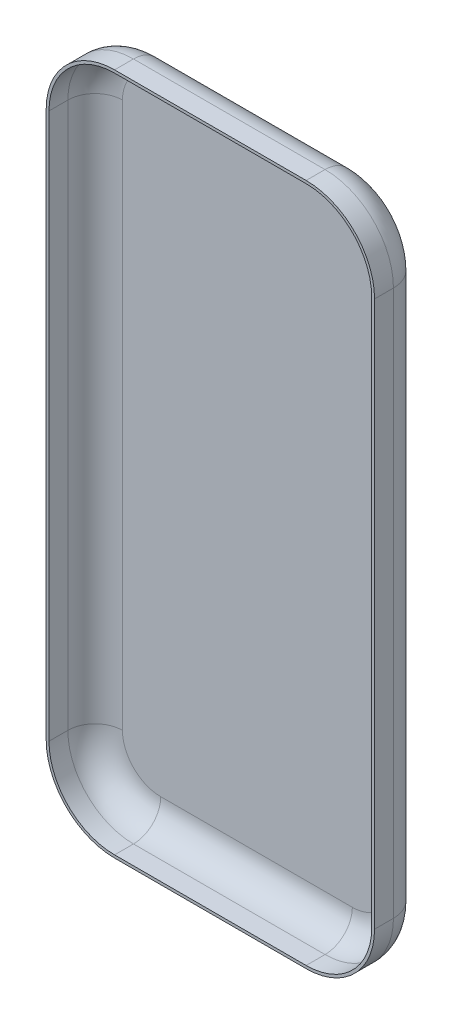
ISO-10303-21;
HEADER;
FILE_DESCRIPTION(('STEP AP214'),'2;1');
FILE_NAME('part.step','',(''),(''),'','','');
FILE_SCHEMA(('AUTOMOTIVE_DESIGN { 1 0 10303 214 1 1 1 1 }'));
ENDSEC;
DATA;
#1=APPLICATION_CONTEXT('core data for automotive mechanical design processes');
#2=APPLICATION_PROTOCOL_DEFINITION('international standard','automotive_design',2000,#1);
#3=PRODUCT_CONTEXT('',#1,'mechanical');
#4=PRODUCT('Part','Part','',(#3));
#5=PRODUCT_RELATED_PRODUCT_CATEGORY('part','',(#4));
#6=PRODUCT_DEFINITION_FORMATION('','',#4);
#7=PRODUCT_DEFINITION_CONTEXT('part definition',#1,'design');
#8=PRODUCT_DEFINITION('design','',#6,#7);
#9=PRODUCT_DEFINITION_SHAPE('','',#8);
#10=(LENGTH_UNIT() NAMED_UNIT(*) SI_UNIT(.MILLI.,.METRE.));
#11=(NAMED_UNIT(*) PLANE_ANGLE_UNIT() SI_UNIT($,.RADIAN.));
#12=(NAMED_UNIT(*) SI_UNIT($,.STERADIAN.) SOLID_ANGLE_UNIT());
#13=UNCERTAINTY_MEASURE_WITH_UNIT(LENGTH_MEASURE(1.E-05),#10,'distance_accuracy_value','');
#14=(GEOMETRIC_REPRESENTATION_CONTEXT(3) GLOBAL_UNCERTAINTY_ASSIGNED_CONTEXT((#13)) GLOBAL_UNIT_ASSIGNED_CONTEXT((#10,
#11,#12)) REPRESENTATION_CONTEXT('',''));
#15=CARTESIAN_POINT('',(0.,0.,0.));
#16=DIRECTION('',(0.,0.,1.));
#17=DIRECTION('',(1.,0.,0.));
#18=AXIS2_PLACEMENT_3D('',#15,#16,#17);
#19=CARTESIAN_POINT('',(-23.8379,0.,-7.112));
#20=DIRECTION('',(-1.,0.,0.));
#21=DIRECTION('',(0.,-1.,0.));
#22=AXIS2_PLACEMENT_3D('',#19,#20,#21);
#23=PLANE('',#22);
#24=DIRECTION('',(0.,0.,1.));
#25=VECTOR('',#24,1.);
#26=CARTESIAN_POINT('',(-23.8379,20.3454,-7.112));
#27=LINE('',#26,#25);
#28=CARTESIAN_POINT('',(-23.8379,20.3454,0.));
#29=VERTEX_POINT('',#28);
#30=CARTESIAN_POINT('',(-23.8379,20.3454,-2.7432));
#31=VERTEX_POINT('',#30);
#32=EDGE_CURVE('E315',#29,#31,#27,.F.);
#33=ORIENTED_EDGE('',*,*,#32,.T.);
#34=DIRECTION('',(0.,-1.,0.));
#35=VECTOR('',#34,1.);
#36=CARTESIAN_POINT('',(-23.8379,-58.902600000003,-2.7432));
#37=LINE('',#36,#35);
#38=CARTESIAN_POINT('',(-23.8379,-58.902600000003,-2.7432));
#39=VERTEX_POINT('',#38);
#40=EDGE_CURVE('E344',#31,#39,#37,.T.);
#41=ORIENTED_EDGE('',*,*,#40,.T.);
#42=DIRECTION('',(0.,0.,1.));
#43=VECTOR('',#42,1.);
#44=CARTESIAN_POINT('',(-23.8379,-58.902600000003,-7.112));
#45=LINE('',#44,#43);
#46=CARTESIAN_POINT('',(-23.8379,-58.902600000003,0.));
#47=VERTEX_POINT('',#46);
#48=EDGE_CURVE('E313',#39,#47,#45,.T.);
#49=ORIENTED_EDGE('',*,*,#48,.T.);
#50=DIRECTION('',(0.,-1.,0.));
#51=VECTOR('',#50,1.);
#52=CARTESIAN_POINT('',(-23.8379,0.,0.));
#53=LINE('',#52,#51);
#54=EDGE_CURVE('E280',#29,#47,#53,.T.);
#55=ORIENTED_EDGE('',*,*,#54,.F.);
#56=EDGE_LOOP('',(#33,#41,#49,#55));
#57=FACE_BOUND('',#56,.T.);
#58=ADVANCED_FACE('F45',(#57),#23,.T.);
#59=CARTESIAN_POINT('',(23.8379,-68.834000000003,-7.112));
#60=DIRECTION('',(1.,0.,0.));
#61=DIRECTION('',(0.,1.,0.));
#62=AXIS2_PLACEMENT_3D('',#59,#60,#61);
#63=PLANE('',#62);
#64=DIRECTION('',(0.,0.,1.));
#65=VECTOR('',#64,1.);
#66=CARTESIAN_POINT('',(23.8379,-58.902600000003,-7.112));
#67=LINE('',#66,#65);
#68=CARTESIAN_POINT('',(23.8379,-58.902600000003,0.));
#69=VERTEX_POINT('',#68);
#70=CARTESIAN_POINT('',(23.8379,-58.902600000003,-2.7432));
#71=VERTEX_POINT('',#70);
#72=EDGE_CURVE('E306',#69,#71,#67,.F.);
#73=ORIENTED_EDGE('',*,*,#72,.T.);
#74=DIRECTION('',(0.,1.,0.));
#75=VECTOR('',#74,1.);
#76=CARTESIAN_POINT('',(23.8379,20.3454,-2.7432));
#77=LINE('',#76,#75);
#78=CARTESIAN_POINT('',(23.8379,20.3454,-2.7432));
#79=VERTEX_POINT('',#78);
#80=EDGE_CURVE('E11',#71,#79,#77,.T.);
#81=ORIENTED_EDGE('',*,*,#80,.T.);
#82=DIRECTION('',(0.,0.,-1.));
#83=VECTOR('',#82,1.);
#84=CARTESIAN_POINT('',(23.8379,20.3454,-7.112));
#85=LINE('',#84,#83);
#86=CARTESIAN_POINT('',(23.8379,20.3454,0.));
#87=VERTEX_POINT('',#86);
#88=EDGE_CURVE('E304',#79,#87,#85,.F.);
#89=ORIENTED_EDGE('',*,*,#88,.T.);
#90=DIRECTION('',(0.,1.,0.));
#91=VECTOR('',#90,1.);
#92=CARTESIAN_POINT('',(23.8379,-68.834000000003,0.));
#93=LINE('',#92,#91);
#94=EDGE_CURVE('E287',#69,#87,#93,.T.);
#95=ORIENTED_EDGE('',*,*,#94,.F.);
#96=EDGE_LOOP('',(#73,#81,#89,#95));
#97=FACE_BOUND('',#96,.T.);
#98=ADVANCED_FACE('F388',(#97),#63,.T.);
#99=CARTESIAN_POINT('',(-23.8379,-68.834000000003,-7.112));
#100=DIRECTION('',(0.,-1.,0.));
#101=DIRECTION('',(0.,0.,-1.));
#102=AXIS2_PLACEMENT_3D('',#99,#100,#101);
#103=PLANE('',#102);
#104=DIRECTION('',(0.,0.,1.));
#105=VECTOR('',#104,1.);
#106=CARTESIAN_POINT('',(-13.9065,-68.834000000003,-7.112));
#107=LINE('',#106,#105);
#108=CARTESIAN_POINT('',(-13.9065,-68.834000000003,0.));
#109=VERTEX_POINT('',#108);
#110=CARTESIAN_POINT('',(-13.9065,-68.834000000003,-2.7432));
#111=VERTEX_POINT('',#110);
#112=EDGE_CURVE('E291',#109,#111,#107,.F.);
#113=ORIENTED_EDGE('',*,*,#112,.T.);
#114=DIRECTION('',(1.,0.,0.));
#115=VECTOR('',#114,1.);
#116=CARTESIAN_POINT('',(13.9065,-68.834000000003,-2.7432));
#117=LINE('',#116,#115);
#118=CARTESIAN_POINT('',(13.9065,-68.834000000003,-2.7432));
#119=VERTEX_POINT('',#118);
#120=EDGE_CURVE('E349',#111,#119,#117,.T.);
#121=ORIENTED_EDGE('',*,*,#120,.T.);
#122=DIRECTION('',(0.,0.,1.));
#123=VECTOR('',#122,1.);
#124=CARTESIAN_POINT('',(13.9065,-68.834000000003,-7.112));
#125=LINE('',#124,#123);
#126=CARTESIAN_POINT('',(13.9065,-68.834000000003,0.));
#127=VERTEX_POINT('',#126);
#128=EDGE_CURVE('E294',#119,#127,#125,.T.);
#129=ORIENTED_EDGE('',*,*,#128,.T.);
#130=DIRECTION('',(1.,0.,0.));
#131=VECTOR('',#130,1.);
#132=CARTESIAN_POINT('',(-23.8379,-68.834000000003,0.));
#133=LINE('',#132,#131);
#134=EDGE_CURVE('E284',#109,#127,#133,.T.);
#135=ORIENTED_EDGE('',*,*,#134,.F.);
#136=EDGE_LOOP('',(#113,#121,#129,#135));
#137=FACE_BOUND('',#136,.T.);
#138=ADVANCED_FACE('F418',(#137),#103,.T.);
#139=CARTESIAN_POINT('',(-23.8379,-68.834000000003,-7.112));
#140=DIRECTION('',(0.,0.,1.));
#141=DIRECTION('',(1.,0.,0.));
#142=AXIS2_PLACEMENT_3D('',#139,#140,#141);
#143=PLANE('',#142);
#144=DIRECTION('',(0.,-1.,0.));
#145=VECTOR('',#144,1.);
#146=CARTESIAN_POINT('',(-19.4691,20.3454,-7.112));
#147=LINE('',#146,#145);
#148=CARTESIAN_POINT('',(-19.4691,-58.902600000003,-7.112));
#149=VERTEX_POINT('',#148);
#150=CARTESIAN_POINT('',(-19.4691,20.3454,-7.112));
#151=VERTEX_POINT('',#150);
#152=EDGE_CURVE('E327',#149,#151,#147,.F.);
#153=ORIENTED_EDGE('',*,*,#152,.T.);
#154=CARTESIAN_POINT('',(-13.9065,20.3454,-7.112));
#155=DIRECTION('',(0.,0.,1.));
#156=DIRECTION('',(1.,0.,0.));
#157=AXIS2_PLACEMENT_3D('',#154,#155,#156);
#158=CIRCLE('',#157,5.5626);
#159=CARTESIAN_POINT('',(-13.9065,25.908,-7.112));
#160=VERTEX_POINT('',#159);
#161=EDGE_CURVE('E334',#151,#160,#158,.F.);
#162=ORIENTED_EDGE('',*,*,#161,.T.);
#163=DIRECTION('',(-1.,0.,0.));
#164=VECTOR('',#163,1.);
#165=CARTESIAN_POINT('',(13.9065,25.908,-7.112));
#166=LINE('',#165,#164);
#167=CARTESIAN_POINT('',(13.9065,25.908,-7.112));
#168=VERTEX_POINT('',#167);
#169=EDGE_CURVE('E332',#160,#168,#166,.F.);
#170=ORIENTED_EDGE('',*,*,#169,.T.);
#171=CARTESIAN_POINT('',(13.9065,20.3454,-7.112));
#172=DIRECTION('',(0.,0.,1.));
#173=DIRECTION('',(1.,0.,0.));
#174=AXIS2_PLACEMENT_3D('',#171,#172,#173);
#175=CIRCLE('',#174,5.5626);
#176=CARTESIAN_POINT('',(19.4691,20.3454,-7.112));
#177=VERTEX_POINT('',#176);
#178=EDGE_CURVE('E330',#168,#177,#175,.F.);
#179=ORIENTED_EDGE('',*,*,#178,.T.);
#180=DIRECTION('',(0.,1.,0.));
#181=VECTOR('',#180,1.);
#182=CARTESIAN_POINT('',(19.4691,-58.902600000003,-7.112));
#183=LINE('',#182,#181);
#184=CARTESIAN_POINT('',(19.4691,-58.902600000003,-7.112));
#185=VERTEX_POINT('',#184);
#186=EDGE_CURVE('E320',#177,#185,#183,.F.);
#187=ORIENTED_EDGE('',*,*,#186,.T.);
#188=CARTESIAN_POINT('',(13.9065,-58.902600000003,-7.112));
#189=DIRECTION('',(0.,0.,1.));
#190=DIRECTION('',(1.,0.,0.));
#191=AXIS2_PLACEMENT_3D('',#188,#189,#190);
#192=CIRCLE('',#191,5.5626);
#193=CARTESIAN_POINT('',(13.9065,-64.465200000003,-7.112));
#194=VERTEX_POINT('',#193);
#195=EDGE_CURVE('E318',#185,#194,#192,.F.);
#196=ORIENTED_EDGE('',*,*,#195,.T.);
#197=DIRECTION('',(1.,0.,0.));
#198=VECTOR('',#197,1.);
#199=CARTESIAN_POINT('',(-13.9065,-64.465200000003,-7.112));
#200=LINE('',#199,#198);
#201=CARTESIAN_POINT('',(-13.9065,-64.465200000003,-7.112));
#202=VERTEX_POINT('',#201);
#203=EDGE_CURVE('E323',#194,#202,#200,.F.);
#204=ORIENTED_EDGE('',*,*,#203,.T.);
#205=CARTESIAN_POINT('',(-13.9065,-58.902600000003,-7.112));
#206=DIRECTION('',(0.,0.,1.));
#207=DIRECTION('',(1.,0.,0.));
#208=AXIS2_PLACEMENT_3D('',#205,#206,#207);
#209=CIRCLE('',#208,5.5626);
#210=EDGE_CURVE('E325',#202,#149,#209,.F.);
#211=ORIENTED_EDGE('',*,*,#210,.T.);
#212=EDGE_LOOP('',(#153,#162,#170,#179,#187,#196,#204,#211));
#213=FACE_BOUND('',#212,.T.);
#214=ADVANCED_FACE('F437',(#213),#143,.F.);
#215=CARTESIAN_POINT('',(-23.8379,-68.834000000003,0.));
#216=DIRECTION('',(0.,0.,1.));
#217=DIRECTION('',(1.,0.,0.));
#218=AXIS2_PLACEMENT_3D('',#215,#216,#217);
#219=PLANE('',#218);
#220=DIRECTION('',(1.,0.,0.));
#221=VECTOR('',#220,1.);
#222=CARTESIAN_POINT('',(-23.8379,-68.427600000003,0.));
#223=LINE('',#222,#221);
#224=CARTESIAN_POINT('',(-13.9065,-68.427600000003,0.));
#225=VERTEX_POINT('',#224);
#226=CARTESIAN_POINT('',(13.9065,-68.427600000003,0.));
#227=VERTEX_POINT('',#226);
#228=EDGE_CURVE('E256',#225,#227,#223,.T.);
#229=ORIENTED_EDGE('',*,*,#228,.F.);
#230=CARTESIAN_POINT('',(-13.9065,-58.902600000003,0.));
#231=DIRECTION('',(0.,0.,1.));
#232=DIRECTION('',(1.,0.,0.));
#233=AXIS2_PLACEMENT_3D('',#230,#231,#232);
#234=CIRCLE('',#233,9.525);
#235=CARTESIAN_POINT('',(-23.4315,-58.902600000003,0.));
#236=VERTEX_POINT('',#235);
#237=EDGE_CURVE('E258',#236,#225,#234,.T.);
#238=ORIENTED_EDGE('',*,*,#237,.F.);
#239=DIRECTION('',(0.,-1.,0.));
#240=VECTOR('',#239,1.);
#241=CARTESIAN_POINT('',(-23.4315,-68.834000000003,0.));
#242=LINE('',#241,#240);
#243=CARTESIAN_POINT('',(-23.4315,20.3454,0.));
#244=VERTEX_POINT('',#243);
#245=EDGE_CURVE('E63',#244,#236,#242,.T.);
#246=ORIENTED_EDGE('',*,*,#245,.F.);
#247=CARTESIAN_POINT('',(-13.9065,20.3454,0.));
#248=DIRECTION('',(0.,0.,1.));
#249=DIRECTION('',(1.,0.,0.));
#250=AXIS2_PLACEMENT_3D('',#247,#248,#249);
#251=CIRCLE('',#250,9.525);
#252=CARTESIAN_POINT('',(-13.9065,29.8704,0.));
#253=VERTEX_POINT('',#252);
#254=EDGE_CURVE('E260',#253,#244,#251,.T.);
#255=ORIENTED_EDGE('',*,*,#254,.F.);
#256=DIRECTION('',(1.,0.,0.));
#257=VECTOR('',#256,1.);
#258=CARTESIAN_POINT('',(-23.8379,29.8704,0.));
#259=LINE('',#258,#257);
#260=CARTESIAN_POINT('',(13.9065,29.8704,0.));
#261=VERTEX_POINT('',#260);
#262=EDGE_CURVE('E257',#253,#261,#259,.T.);
#263=ORIENTED_EDGE('',*,*,#262,.T.);
#264=CARTESIAN_POINT('',(13.9065,20.3454,0.));
#265=DIRECTION('',(0.,0.,1.));
#266=DIRECTION('',(1.,0.,0.));
#267=AXIS2_PLACEMENT_3D('',#264,#265,#266);
#268=CIRCLE('',#267,9.525);
#269=CARTESIAN_POINT('',(23.4315,20.3454,0.));
#270=VERTEX_POINT('',#269);
#271=EDGE_CURVE('E268',#270,#261,#268,.T.);
#272=ORIENTED_EDGE('',*,*,#271,.F.);
#273=DIRECTION('',(0.,1.,0.));
#274=VECTOR('',#273,1.);
#275=CARTESIAN_POINT('',(23.4315,-68.834000000003,0.));
#276=LINE('',#275,#274);
#277=CARTESIAN_POINT('',(23.4315,-58.902600000003,0.));
#278=VERTEX_POINT('',#277);
#279=EDGE_CURVE('E264',#278,#270,#276,.T.);
#280=ORIENTED_EDGE('',*,*,#279,.F.);
#281=CARTESIAN_POINT('',(13.9065,-58.902600000003,0.));
#282=DIRECTION('',(0.,0.,1.));
#283=DIRECTION('',(1.,0.,0.));
#284=AXIS2_PLACEMENT_3D('',#281,#282,#283);
#285=CIRCLE('',#284,9.525);
#286=EDGE_CURVE('E265',#227,#278,#285,.T.);
#287=ORIENTED_EDGE('',*,*,#286,.F.);
#288=EDGE_LOOP('',(#229,#238,#246,#255,#263,#272,#280,#287));
#289=FACE_BOUND('',#288,.T.);
#290=ORIENTED_EDGE('',*,*,#134,.T.);
#291=CARTESIAN_POINT('',(13.9065,-58.902600000003,0.));
#292=DIRECTION('',(0.,0.,1.));
#293=DIRECTION('',(1.,0.,0.));
#294=AXIS2_PLACEMENT_3D('',#291,#292,#293);
#295=CIRCLE('',#294,9.9314);
#296=EDGE_CURVE('E302',#127,#69,#295,.T.);
#297=ORIENTED_EDGE('',*,*,#296,.T.);
#298=ORIENTED_EDGE('',*,*,#94,.T.);
#299=CARTESIAN_POINT('',(13.9065,20.3454,0.));
#300=DIRECTION('',(0.,0.,1.));
#301=DIRECTION('',(1.,0.,0.));
#302=AXIS2_PLACEMENT_3D('',#299,#300,#301);
#303=CIRCLE('',#302,9.9314);
#304=CARTESIAN_POINT('',(13.9065,30.2768,0.));
#305=VERTEX_POINT('',#304);
#306=EDGE_CURVE('E300',#87,#305,#303,.T.);
#307=ORIENTED_EDGE('',*,*,#306,.T.);
#308=DIRECTION('',(1.,0.,0.));
#309=VECTOR('',#308,1.);
#310=CARTESIAN_POINT('',(-23.8379,30.2768,0.));
#311=LINE('',#310,#309);
#312=CARTESIAN_POINT('',(-13.9065,30.2768,0.));
#313=VERTEX_POINT('',#312);
#314=EDGE_CURVE('E277',#313,#305,#311,.T.);
#315=ORIENTED_EDGE('',*,*,#314,.F.);
#316=CARTESIAN_POINT('',(-13.9065,20.3454,0.));
#317=DIRECTION('',(0.,0.,1.));
#318=DIRECTION('',(1.,0.,0.));
#319=AXIS2_PLACEMENT_3D('',#316,#317,#318);
#320=CIRCLE('',#319,9.9314);
#321=EDGE_CURVE('E298',#313,#29,#320,.T.);
#322=ORIENTED_EDGE('',*,*,#321,.T.);
#323=ORIENTED_EDGE('',*,*,#54,.T.);
#324=CARTESIAN_POINT('',(-13.9065,-58.902600000003,0.));
#325=DIRECTION('',(0.,0.,1.));
#326=DIRECTION('',(1.,0.,0.));
#327=AXIS2_PLACEMENT_3D('',#324,#325,#326);
#328=CIRCLE('',#327,9.9314);
#329=EDGE_CURVE('E296',#47,#109,#328,.T.);
#330=ORIENTED_EDGE('',*,*,#329,.T.);
#331=EDGE_LOOP('',(#290,#297,#298,#307,#315,#322,#323,#330));
#332=FACE_BOUND('',#331,.T.);
#333=ADVANCED_FACE('F396',(#289,#332),#219,.T.);
#334=CARTESIAN_POINT('',(-23.8379,30.2768,0.));
#335=DIRECTION('',(0.,1.,0.));
#336=DIRECTION('',(0.,0.,1.));
#337=AXIS2_PLACEMENT_3D('',#334,#335,#336);
#338=PLANE('',#337);
#339=DIRECTION('',(0.,0.,-1.));
#340=VECTOR('',#339,1.);
#341=CARTESIAN_POINT('',(13.9065,30.2768,0.));
#342=LINE('',#341,#340);
#343=CARTESIAN_POINT('',(13.9065,30.2768,-2.7432));
#344=VERTEX_POINT('',#343);
#345=EDGE_CURVE('E310',#305,#344,#342,.T.);
#346=ORIENTED_EDGE('',*,*,#345,.T.);
#347=DIRECTION('',(-1.,0.,0.));
#348=VECTOR('',#347,1.);
#349=CARTESIAN_POINT('',(-13.9065,30.2768,-2.7432));
#350=LINE('',#349,#348);
#351=CARTESIAN_POINT('',(-13.9065,30.2768,-2.7432));
#352=VERTEX_POINT('',#351);
#353=EDGE_CURVE('E340',#344,#352,#350,.T.);
#354=ORIENTED_EDGE('',*,*,#353,.T.);
#355=DIRECTION('',(0.,0.,1.));
#356=VECTOR('',#355,1.);
#357=CARTESIAN_POINT('',(-13.9065,30.2768,0.));
#358=LINE('',#357,#356);
#359=EDGE_CURVE('E308',#352,#313,#358,.T.);
#360=ORIENTED_EDGE('',*,*,#359,.T.);
#361=ORIENTED_EDGE('',*,*,#314,.T.);
#362=EDGE_LOOP('',(#346,#354,#360,#361));
#363=FACE_BOUND('',#362,.T.);
#364=ADVANCED_FACE('F398',(#363),#338,.T.);
#365=CARTESIAN_POINT('',(13.9065,-58.902600000003,-7.112));
#366=DIRECTION('',(0.,0.,1.));
#367=DIRECTION('',(1.,0.,0.));
#368=AXIS2_PLACEMENT_3D('',#365,#366,#367);
#369=CYLINDRICAL_SURFACE('',#368,9.9314);
#370=ORIENTED_EDGE('',*,*,#128,.F.);
#371=CARTESIAN_POINT('',(13.9065,-58.902600000003,-2.7432));
#372=DIRECTION('',(0.,0.,1.));
#373=DIRECTION('',(1.,0.,0.));
#374=AXIS2_PLACEMENT_3D('',#371,#372,#373);
#375=CIRCLE('',#374,9.9314);
#376=EDGE_CURVE('E55',#119,#71,#375,.T.);
#377=ORIENTED_EDGE('',*,*,#376,.T.);
#378=ORIENTED_EDGE('',*,*,#72,.F.);
#379=ORIENTED_EDGE('',*,*,#296,.F.);
#380=EDGE_LOOP('',(#370,#377,#378,#379));
#381=FACE_BOUND('',#380,.T.);
#382=ADVANCED_FACE('F420',(#381),#369,.T.);
#383=CARTESIAN_POINT('',(13.9065,20.3454,0.));
#384=DIRECTION('',(0.,0.,-1.));
#385=DIRECTION('',(-1.,0.,0.));
#386=AXIS2_PLACEMENT_3D('',#383,#384,#385);
#387=CYLINDRICAL_SURFACE('',#386,9.9314);
#388=ORIENTED_EDGE('',*,*,#88,.F.);
#389=CARTESIAN_POINT('',(13.9065,20.3454,-2.7432));
#390=DIRECTION('',(0.,0.,1.));
#391=DIRECTION('',(1.,0.,0.));
#392=AXIS2_PLACEMENT_3D('',#389,#390,#391);
#393=CIRCLE('',#392,9.9314);
#394=EDGE_CURVE('E342',#79,#344,#393,.T.);
#395=ORIENTED_EDGE('',*,*,#394,.T.);
#396=ORIENTED_EDGE('',*,*,#345,.F.);
#397=ORIENTED_EDGE('',*,*,#306,.F.);
#398=EDGE_LOOP('',(#388,#395,#396,#397));
#399=FACE_BOUND('',#398,.T.);
#400=ADVANCED_FACE('F392',(#399),#387,.T.);
#401=CARTESIAN_POINT('',(-13.9065,20.3454,0.));
#402=DIRECTION('',(0.,0.,1.));
#403=DIRECTION('',(1.,0.,0.));
#404=AXIS2_PLACEMENT_3D('',#401,#402,#403);
#405=CYLINDRICAL_SURFACE('',#404,9.9314);
#406=ORIENTED_EDGE('',*,*,#359,.F.);
#407=CARTESIAN_POINT('',(-13.9065,20.3454,-2.7432));
#408=DIRECTION('',(0.,0.,1.));
#409=DIRECTION('',(1.,0.,0.));
#410=AXIS2_PLACEMENT_3D('',#407,#408,#409);
#411=CIRCLE('',#410,9.9314);
#412=EDGE_CURVE('E337',#352,#31,#411,.T.);
#413=ORIENTED_EDGE('',*,*,#412,.T.);
#414=ORIENTED_EDGE('',*,*,#32,.F.);
#415=ORIENTED_EDGE('',*,*,#321,.F.);
#416=EDGE_LOOP('',(#406,#413,#414,#415));
#417=FACE_BOUND('',#416,.T.);
#418=ADVANCED_FACE('F406',(#417),#405,.T.);
#419=CARTESIAN_POINT('',(-13.9065,-58.902600000003,-7.112));
#420=DIRECTION('',(0.,0.,1.));
#421=DIRECTION('',(1.,0.,0.));
#422=AXIS2_PLACEMENT_3D('',#419,#420,#421);
#423=CYLINDRICAL_SURFACE('',#422,9.9314);
#424=ORIENTED_EDGE('',*,*,#48,.F.);
#425=CARTESIAN_POINT('',(-13.9065,-58.902600000003,-2.7432));
#426=DIRECTION('',(0.,0.,1.));
#427=DIRECTION('',(1.,0.,0.));
#428=AXIS2_PLACEMENT_3D('',#425,#426,#427);
#429=CIRCLE('',#428,9.9314);
#430=EDGE_CURVE('E347',#39,#111,#429,.T.);
#431=ORIENTED_EDGE('',*,*,#430,.T.);
#432=ORIENTED_EDGE('',*,*,#112,.F.);
#433=ORIENTED_EDGE('',*,*,#329,.F.);
#434=EDGE_LOOP('',(#424,#431,#432,#433));
#435=FACE_BOUND('',#434,.T.);
#436=ADVANCED_FACE('F415',(#435),#423,.T.);
#437=CARTESIAN_POINT('',(13.9065,-58.902600000003,-2.7432));
#438=DIRECTION('',(0.,0.,1.));
#439=DIRECTION('',(1.,0.,0.));
#440=AXIS2_PLACEMENT_3D('',#437,#438,#439);
#441=TOROIDAL_SURFACE('',#440,5.5626,4.3688);
#442=CARTESIAN_POINT('',(19.4691,-58.902600000003,-2.7432));
#443=DIRECTION('',(0.,1.,0.));
#444=DIRECTION('',(0.,0.,1.));
#445=AXIS2_PLACEMENT_3D('',#442,#443,#444);
#446=CIRCLE('',#445,4.3688);
#447=EDGE_CURVE('E368',#71,#185,#446,.T.);
#448=ORIENTED_EDGE('',*,*,#447,.F.);
#449=ORIENTED_EDGE('',*,*,#376,.F.);
#450=CARTESIAN_POINT('',(13.9065,-64.465200000003,-2.7432));
#451=DIRECTION('',(-1.,0.,0.));
#452=DIRECTION('',(0.,0.,1.));
#453=AXIS2_PLACEMENT_3D('',#450,#451,#452);
#454=CIRCLE('',#453,4.3688);
#455=EDGE_CURVE('E49',#194,#119,#454,.T.);
#456=ORIENTED_EDGE('',*,*,#455,.F.);
#457=ORIENTED_EDGE('',*,*,#195,.F.);
#458=EDGE_LOOP('',(#448,#449,#456,#457));
#459=FACE_BOUND('',#458,.T.);
#460=ADVANCED_FACE('F47',(#459),#441,.T.);
#461=CARTESIAN_POINT('',(-23.8379,-64.465200000003,-2.7432));
#462=DIRECTION('',(-1.,0.,0.));
#463=DIRECTION('',(0.,0.,1.));
#464=AXIS2_PLACEMENT_3D('',#461,#462,#463);
#465=CYLINDRICAL_SURFACE('',#464,4.3688);
#466=ORIENTED_EDGE('',*,*,#455,.T.);
#467=ORIENTED_EDGE('',*,*,#120,.F.);
#468=CARTESIAN_POINT('',(-13.9065,-64.465200000003,-2.7432));
#469=DIRECTION('',(-1.,0.,0.));
#470=DIRECTION('',(0.,0.,1.));
#471=AXIS2_PLACEMENT_3D('',#468,#469,#470);
#472=CIRCLE('',#471,4.3688);
#473=EDGE_CURVE('E366',#202,#111,#472,.T.);
#474=ORIENTED_EDGE('',*,*,#473,.F.);
#475=ORIENTED_EDGE('',*,*,#203,.F.);
#476=EDGE_LOOP('',(#466,#467,#474,#475));
#477=FACE_BOUND('',#476,.T.);
#478=ADVANCED_FACE('F379',(#477),#465,.T.);
#479=CARTESIAN_POINT('',(19.4691,-68.834000000003,-2.7432));
#480=DIRECTION('',(0.,-1.,0.));
#481=DIRECTION('',(1.,0.,0.));
#482=AXIS2_PLACEMENT_3D('',#479,#480,#481);
#483=CYLINDRICAL_SURFACE('',#482,4.3688);
#484=ORIENTED_EDGE('',*,*,#447,.T.);
#485=ORIENTED_EDGE('',*,*,#186,.F.);
#486=CARTESIAN_POINT('',(19.4691,20.3454,-2.7432));
#487=DIRECTION('',(0.,1.,0.));
#488=DIRECTION('',(0.,0.,1.));
#489=AXIS2_PLACEMENT_3D('',#486,#487,#488);
#490=CIRCLE('',#489,4.3688);
#491=EDGE_CURVE('E363',#79,#177,#490,.T.);
#492=ORIENTED_EDGE('',*,*,#491,.F.);
#493=ORIENTED_EDGE('',*,*,#80,.F.);
#494=EDGE_LOOP('',(#484,#485,#492,#493));
#495=FACE_BOUND('',#494,.T.);
#496=ADVANCED_FACE('F384',(#495),#483,.T.);
#497=CARTESIAN_POINT('',(-13.9065,-58.902600000003,-2.7432));
#498=DIRECTION('',(0.,0.,1.));
#499=DIRECTION('',(1.,0.,0.));
#500=AXIS2_PLACEMENT_3D('',#497,#498,#499);
#501=TOROIDAL_SURFACE('',#500,5.5626,4.3688);
#502=ORIENTED_EDGE('',*,*,#473,.T.);
#503=ORIENTED_EDGE('',*,*,#430,.F.);
#504=CARTESIAN_POINT('',(-19.4691,-58.902600000003,-2.7432));
#505=DIRECTION('',(0.,1.,0.));
#506=DIRECTION('',(0.,0.,1.));
#507=AXIS2_PLACEMENT_3D('',#504,#505,#506);
#508=CIRCLE('',#507,4.3688);
#509=EDGE_CURVE('E360',#149,#39,#508,.T.);
#510=ORIENTED_EDGE('',*,*,#509,.F.);
#511=ORIENTED_EDGE('',*,*,#210,.F.);
#512=EDGE_LOOP('',(#502,#503,#510,#511));
#513=FACE_BOUND('',#512,.T.);
#514=ADVANCED_FACE('F526',(#513),#501,.T.);
#515=CARTESIAN_POINT('',(13.9065,20.3454,-2.7432));
#516=DIRECTION('',(0.,0.,1.));
#517=DIRECTION('',(1.,0.,0.));
#518=AXIS2_PLACEMENT_3D('',#515,#516,#517);
#519=TOROIDAL_SURFACE('',#518,5.5626,4.3688);
#520=ORIENTED_EDGE('',*,*,#491,.T.);
#521=ORIENTED_EDGE('',*,*,#178,.F.);
#522=CARTESIAN_POINT('',(13.9065,25.908,-2.7432));
#523=DIRECTION('',(-1.,0.,0.));
#524=DIRECTION('',(0.,0.,1.));
#525=AXIS2_PLACEMENT_3D('',#522,#523,#524);
#526=CIRCLE('',#525,4.3688);
#527=EDGE_CURVE('E357',#344,#168,#526,.T.);
#528=ORIENTED_EDGE('',*,*,#527,.F.);
#529=ORIENTED_EDGE('',*,*,#394,.F.);
#530=EDGE_LOOP('',(#520,#521,#528,#529));
#531=FACE_BOUND('',#530,.T.);
#532=ADVANCED_FACE('F522',(#531),#519,.T.);
#533=CARTESIAN_POINT('',(-19.4691,0.,-2.7432));
#534=DIRECTION('',(0.,1.,0.));
#535=DIRECTION('',(-1.,0.,0.));
#536=AXIS2_PLACEMENT_3D('',#533,#534,#535);
#537=CYLINDRICAL_SURFACE('',#536,4.3688);
#538=ORIENTED_EDGE('',*,*,#509,.T.);
#539=ORIENTED_EDGE('',*,*,#40,.F.);
#540=CARTESIAN_POINT('',(-19.4691,20.3454,-2.7432));
#541=DIRECTION('',(0.,1.,0.));
#542=DIRECTION('',(0.,0.,1.));
#543=AXIS2_PLACEMENT_3D('',#540,#541,#542);
#544=CIRCLE('',#543,4.3688);
#545=EDGE_CURVE('E354',#151,#31,#544,.T.);
#546=ORIENTED_EDGE('',*,*,#545,.F.);
#547=ORIENTED_EDGE('',*,*,#152,.F.);
#548=EDGE_LOOP('',(#538,#539,#546,#547));
#549=FACE_BOUND('',#548,.T.);
#550=ADVANCED_FACE('F514',(#549),#537,.T.);
#551=CARTESIAN_POINT('',(-23.8379,25.908,-2.7432));
#552=DIRECTION('',(1.,0.,0.));
#553=DIRECTION('',(0.,0.,-1.));
#554=AXIS2_PLACEMENT_3D('',#551,#552,#553);
#555=CYLINDRICAL_SURFACE('',#554,4.3688);
#556=ORIENTED_EDGE('',*,*,#527,.T.);
#557=ORIENTED_EDGE('',*,*,#169,.F.);
#558=CARTESIAN_POINT('',(-13.9065,25.908,-2.7432));
#559=DIRECTION('',(-1.,0.,0.));
#560=DIRECTION('',(0.,0.,1.));
#561=AXIS2_PLACEMENT_3D('',#558,#559,#560);
#562=CIRCLE('',#561,4.3688);
#563=EDGE_CURVE('E352',#352,#160,#562,.T.);
#564=ORIENTED_EDGE('',*,*,#563,.F.);
#565=ORIENTED_EDGE('',*,*,#353,.F.);
#566=EDGE_LOOP('',(#556,#557,#564,#565));
#567=FACE_BOUND('',#566,.T.);
#568=ADVANCED_FACE('F508',(#567),#555,.T.);
#569=CARTESIAN_POINT('',(-13.9065,20.3454,-2.7432));
#570=DIRECTION('',(0.,0.,1.));
#571=DIRECTION('',(1.,0.,0.));
#572=AXIS2_PLACEMENT_3D('',#569,#570,#571);
#573=TOROIDAL_SURFACE('',#572,5.5626,4.3688);
#574=ORIENTED_EDGE('',*,*,#545,.T.);
#575=ORIENTED_EDGE('',*,*,#412,.F.);
#576=ORIENTED_EDGE('',*,*,#563,.T.);
#577=ORIENTED_EDGE('',*,*,#161,.F.);
#578=EDGE_LOOP('',(#574,#575,#576,#577));
#579=FACE_BOUND('',#578,.T.);
#580=ADVANCED_FACE('F504',(#579),#573,.T.);
#581=CARTESIAN_POINT('',(-23.4315,0.,-7.112));
#582=DIRECTION('',(-1.,0.,0.));
#583=DIRECTION('',(0.,-1.,0.));
#584=AXIS2_PLACEMENT_3D('',#581,#582,#583);
#585=PLANE('',#584);
#586=DIRECTION('',(0.,0.,1.));
#587=VECTOR('',#586,1.);
#588=CARTESIAN_POINT('',(-23.4315,20.3454,-7.112));
#589=LINE('',#588,#587);
#590=CARTESIAN_POINT('',(-23.4315,20.3454,-2.7432));
#591=VERTEX_POINT('',#590);
#592=EDGE_CURVE('E228',#244,#591,#589,.F.);
#593=ORIENTED_EDGE('',*,*,#592,.F.);
#594=ORIENTED_EDGE('',*,*,#245,.T.);
#595=DIRECTION('',(0.,0.,1.));
#596=VECTOR('',#595,1.);
#597=CARTESIAN_POINT('',(-23.4315,-58.902600000003,-7.112));
#598=LINE('',#597,#596);
#599=CARTESIAN_POINT('',(-23.4315,-58.902600000003,-2.7432));
#600=VERTEX_POINT('',#599);
#601=EDGE_CURVE('E223',#600,#236,#598,.T.);
#602=ORIENTED_EDGE('',*,*,#601,.F.);
#603=DIRECTION('',(0.,-1.,0.));
#604=VECTOR('',#603,1.);
#605=CARTESIAN_POINT('',(-23.4315,0.,-2.7432));
#606=LINE('',#605,#604);
#607=EDGE_CURVE('E211',#591,#600,#606,.T.);
#608=ORIENTED_EDGE('',*,*,#607,.F.);
#609=EDGE_LOOP('',(#593,#594,#602,#608));
#610=FACE_BOUND('',#609,.T.);
#611=ADVANCED_FACE('F225',(#610),#585,.F.);
#612=CARTESIAN_POINT('',(23.4315,-68.834000000003,-7.112));
#613=DIRECTION('',(1.,0.,0.));
#614=DIRECTION('',(0.,1.,0.));
#615=AXIS2_PLACEMENT_3D('',#612,#613,#614);
#616=PLANE('',#615);
#617=DIRECTION('',(0.,0.,1.));
#618=VECTOR('',#617,1.);
#619=CARTESIAN_POINT('',(23.4315,-58.902600000003,-7.112));
#620=LINE('',#619,#618);
#621=CARTESIAN_POINT('',(23.4315,-58.902600000003,-2.7432));
#622=VERTEX_POINT('',#621);
#623=EDGE_CURVE('E871',#278,#622,#620,.F.);
#624=ORIENTED_EDGE('',*,*,#623,.F.);
#625=ORIENTED_EDGE('',*,*,#279,.T.);
#626=DIRECTION('',(0.,0.,1.));
#627=VECTOR('',#626,1.);
#628=CARTESIAN_POINT('',(23.4315,20.3454,-7.112));
#629=LINE('',#628,#627);
#630=CARTESIAN_POINT('',(23.4315,20.3454,-2.7432));
#631=VERTEX_POINT('',#630);
#632=EDGE_CURVE('E267',#631,#270,#629,.T.);
#633=ORIENTED_EDGE('',*,*,#632,.F.);
#634=DIRECTION('',(0.,1.,0.));
#635=VECTOR('',#634,1.);
#636=CARTESIAN_POINT('',(23.4315,-68.834000000003,-2.7432));
#637=LINE('',#636,#635);
#638=EDGE_CURVE('E355',#622,#631,#637,.T.);
#639=ORIENTED_EDGE('',*,*,#638,.F.);
#640=EDGE_LOOP('',(#624,#625,#633,#639));
#641=FACE_BOUND('',#640,.T.);
#642=ADVANCED_FACE('F498',(#641),#616,.F.);
#643=CARTESIAN_POINT('',(-23.8379,-68.427600000003,-7.112));
#644=DIRECTION('',(0.,-1.,0.));
#645=DIRECTION('',(0.,0.,-1.));
#646=AXIS2_PLACEMENT_3D('',#643,#644,#645);
#647=PLANE('',#646);
#648=DIRECTION('',(0.,0.,-1.));
#649=VECTOR('',#648,1.);
#650=CARTESIAN_POINT('',(-13.9065,-68.427600000003,-7.112));
#651=LINE('',#650,#649);
#652=CARTESIAN_POINT('',(-13.9065,-68.427600000003,-2.7432));
#653=VERTEX_POINT('',#652);
#654=EDGE_CURVE('E234',#225,#653,#651,.T.);
#655=ORIENTED_EDGE('',*,*,#654,.F.);
#656=ORIENTED_EDGE('',*,*,#228,.T.);
#657=DIRECTION('',(0.,0.,-1.));
#658=VECTOR('',#657,1.);
#659=CARTESIAN_POINT('',(13.9065,-68.427600000003,-7.112));
#660=LINE('',#659,#658);
#661=CARTESIAN_POINT('',(13.9065,-68.427600000003,-2.7432));
#662=VERTEX_POINT('',#661);
#663=EDGE_CURVE('E261',#662,#227,#660,.F.);
#664=ORIENTED_EDGE('',*,*,#663,.F.);
#665=DIRECTION('',(1.,0.,0.));
#666=VECTOR('',#665,1.);
#667=CARTESIAN_POINT('',(-23.8379,-68.427600000003,-2.7432));
#668=LINE('',#667,#666);
#669=EDGE_CURVE('E238',#653,#662,#668,.T.);
#670=ORIENTED_EDGE('',*,*,#669,.F.);
#671=EDGE_LOOP('',(#655,#656,#664,#670));
#672=FACE_BOUND('',#671,.T.);
#673=ADVANCED_FACE('F494',(#672),#647,.F.);
#674=CARTESIAN_POINT('',(-23.8379,-68.834000000003,-6.7056));
#675=DIRECTION('',(0.,0.,1.));
#676=DIRECTION('',(1.,0.,0.));
#677=AXIS2_PLACEMENT_3D('',#674,#675,#676);
#678=PLANE('',#677);
#679=DIRECTION('',(0.,1.,0.));
#680=VECTOR('',#679,1.);
#681=CARTESIAN_POINT('',(-19.4691,-68.834000000003,-6.7056));
#682=LINE('',#681,#680);
#683=CARTESIAN_POINT('',(-19.4691,-58.902600000003,-6.7056));
#684=VERTEX_POINT('',#683);
#685=CARTESIAN_POINT('',(-19.4691,20.3454,-6.7056));
#686=VERTEX_POINT('',#685);
#687=EDGE_CURVE('E913',#684,#686,#682,.T.);
#688=ORIENTED_EDGE('',*,*,#687,.F.);
#689=CARTESIAN_POINT('',(-13.9065,-58.902600000003,-6.7056));
#690=DIRECTION('',(0.,0.,1.));
#691=DIRECTION('',(1.,0.,0.));
#692=AXIS2_PLACEMENT_3D('',#689,#690,#691);
#693=CIRCLE('',#692,5.56259999999999);
#694=CARTESIAN_POINT('',(-13.9065,-64.465200000003,-6.7056));
#695=VERTEX_POINT('',#694);
#696=EDGE_CURVE('E242',#695,#684,#693,.F.);
#697=ORIENTED_EDGE('',*,*,#696,.F.);
#698=DIRECTION('',(1.,0.,0.));
#699=VECTOR('',#698,1.);
#700=CARTESIAN_POINT('',(-23.8379,-64.465200000003,-6.7056));
#701=LINE('',#700,#699);
#702=CARTESIAN_POINT('',(13.9065,-64.465200000003,-6.7056));
#703=VERTEX_POINT('',#702);
#704=EDGE_CURVE('E910',#703,#695,#701,.F.);
#705=ORIENTED_EDGE('',*,*,#704,.F.);
#706=CARTESIAN_POINT('',(13.9065,-58.902600000003,-6.7056));
#707=DIRECTION('',(0.,0.,1.));
#708=DIRECTION('',(1.,0.,0.));
#709=AXIS2_PLACEMENT_3D('',#706,#707,#708);
#710=CIRCLE('',#709,5.56259999999999);
#711=CARTESIAN_POINT('',(19.4691,-58.902600000003,-6.7056));
#712=VERTEX_POINT('',#711);
#713=EDGE_CURVE('E925',#712,#703,#710,.F.);
#714=ORIENTED_EDGE('',*,*,#713,.F.);
#715=DIRECTION('',(0.,1.,0.));
#716=VECTOR('',#715,1.);
#717=CARTESIAN_POINT('',(19.4691,-68.834000000003,-6.7056));
#718=LINE('',#717,#716);
#719=CARTESIAN_POINT('',(19.4691,20.3454,-6.7056));
#720=VERTEX_POINT('',#719);
#721=EDGE_CURVE('E912',#720,#712,#718,.F.);
#722=ORIENTED_EDGE('',*,*,#721,.F.);
#723=CARTESIAN_POINT('',(13.9065,20.3454,-6.7056));
#724=DIRECTION('',(0.,0.,1.));
#725=DIRECTION('',(1.,0.,0.));
#726=AXIS2_PLACEMENT_3D('',#723,#724,#725);
#727=CIRCLE('',#726,5.5626);
#728=CARTESIAN_POINT('',(13.9065,25.908,-6.7056));
#729=VERTEX_POINT('',#728);
#730=EDGE_CURVE('E916',#729,#720,#727,.F.);
#731=ORIENTED_EDGE('',*,*,#730,.F.);
#732=DIRECTION('',(1.,0.,0.));
#733=VECTOR('',#732,1.);
#734=CARTESIAN_POINT('',(-23.8379,25.908,-6.7056));
#735=LINE('',#734,#733);
#736=CARTESIAN_POINT('',(-13.9065,25.908,-6.7056));
#737=VERTEX_POINT('',#736);
#738=EDGE_CURVE('E920',#737,#729,#735,.T.);
#739=ORIENTED_EDGE('',*,*,#738,.F.);
#740=CARTESIAN_POINT('',(-13.9065,20.3454,-6.7056));
#741=DIRECTION('',(0.,0.,1.));
#742=DIRECTION('',(1.,0.,0.));
#743=AXIS2_PLACEMENT_3D('',#740,#741,#742);
#744=CIRCLE('',#743,5.5626);
#745=EDGE_CURVE('E917',#686,#737,#744,.F.);
#746=ORIENTED_EDGE('',*,*,#745,.F.);
#747=EDGE_LOOP('',(#688,#697,#705,#714,#722,#731,#739,#746));
#748=FACE_BOUND('',#747,.T.);
#749=ADVANCED_FACE('F490',(#748),#678,.T.);
#750=CARTESIAN_POINT('',(-23.8379,29.8704,0.));
#751=DIRECTION('',(0.,1.,0.));
#752=DIRECTION('',(0.,0.,1.));
#753=AXIS2_PLACEMENT_3D('',#750,#751,#752);
#754=PLANE('',#753);
#755=DIRECTION('',(0.,0.,1.));
#756=VECTOR('',#755,1.);
#757=CARTESIAN_POINT('',(13.9065,29.8704,0.));
#758=LINE('',#757,#756);
#759=CARTESIAN_POINT('',(13.9065,29.8704,-2.7432));
#760=VERTEX_POINT('',#759);
#761=EDGE_CURVE('E229',#261,#760,#758,.F.);
#762=ORIENTED_EDGE('',*,*,#761,.F.);
#763=ORIENTED_EDGE('',*,*,#262,.F.);
#764=DIRECTION('',(0.,0.,1.));
#765=VECTOR('',#764,1.);
#766=CARTESIAN_POINT('',(-13.9065,29.8704,0.));
#767=LINE('',#766,#765);
#768=CARTESIAN_POINT('',(-13.9065,29.8704,-2.7432));
#769=VERTEX_POINT('',#768);
#770=EDGE_CURVE('E877',#769,#253,#767,.T.);
#771=ORIENTED_EDGE('',*,*,#770,.F.);
#772=DIRECTION('',(1.,0.,0.));
#773=VECTOR('',#772,1.);
#774=CARTESIAN_POINT('',(-23.8379,29.8704,-2.7432));
#775=LINE('',#774,#773);
#776=EDGE_CURVE('E889',#760,#769,#775,.F.);
#777=ORIENTED_EDGE('',*,*,#776,.F.);
#778=EDGE_LOOP('',(#762,#763,#771,#777));
#779=FACE_BOUND('',#778,.T.);
#780=ADVANCED_FACE('F486',(#779),#754,.F.);
#781=CARTESIAN_POINT('',(13.9065,-58.902600000003,-7.112));
#782=DIRECTION('',(0.,0.,1.));
#783=DIRECTION('',(1.,0.,0.));
#784=AXIS2_PLACEMENT_3D('',#781,#782,#783);
#785=CYLINDRICAL_SURFACE('',#784,9.525);
#786=ORIENTED_EDGE('',*,*,#663,.T.);
#787=ORIENTED_EDGE('',*,*,#286,.T.);
#788=ORIENTED_EDGE('',*,*,#623,.T.);
#789=CARTESIAN_POINT('',(13.9065,-58.902600000003,-2.7432));
#790=DIRECTION('',(0.,0.,1.));
#791=DIRECTION('',(1.,0.,0.));
#792=AXIS2_PLACEMENT_3D('',#789,#790,#791);
#793=CIRCLE('',#792,9.525);
#794=EDGE_CURVE('E900',#662,#622,#793,.T.);
#795=ORIENTED_EDGE('',*,*,#794,.F.);
#796=EDGE_LOOP('',(#786,#787,#788,#795));
#797=FACE_BOUND('',#796,.T.);
#798=ADVANCED_FACE('F482',(#797),#785,.F.);
#799=CARTESIAN_POINT('',(13.9065,20.3454,0.));
#800=DIRECTION('',(0.,0.,-1.));
#801=DIRECTION('',(-1.,0.,0.));
#802=AXIS2_PLACEMENT_3D('',#799,#800,#801);
#803=CYLINDRICAL_SURFACE('',#802,9.525);
#804=ORIENTED_EDGE('',*,*,#632,.T.);
#805=ORIENTED_EDGE('',*,*,#271,.T.);
#806=ORIENTED_EDGE('',*,*,#761,.T.);
#807=CARTESIAN_POINT('',(13.9065,20.3454,-2.7432));
#808=DIRECTION('',(0.,0.,-1.));
#809=DIRECTION('',(-1.,0.,0.));
#810=AXIS2_PLACEMENT_3D('',#807,#808,#809);
#811=CIRCLE('',#810,9.525);
#812=EDGE_CURVE('E221',#631,#760,#811,.F.);
#813=ORIENTED_EDGE('',*,*,#812,.F.);
#814=EDGE_LOOP('',(#804,#805,#806,#813));
#815=FACE_BOUND('',#814,.T.);
#816=ADVANCED_FACE('F478',(#815),#803,.F.);
#817=CARTESIAN_POINT('',(-13.9065,20.3454,0.));
#818=DIRECTION('',(0.,0.,1.));
#819=DIRECTION('',(1.,0.,0.));
#820=AXIS2_PLACEMENT_3D('',#817,#818,#819);
#821=CYLINDRICAL_SURFACE('',#820,9.525);
#822=ORIENTED_EDGE('',*,*,#770,.T.);
#823=ORIENTED_EDGE('',*,*,#254,.T.);
#824=ORIENTED_EDGE('',*,*,#592,.T.);
#825=CARTESIAN_POINT('',(-13.9065,20.3454,-2.7432));
#826=DIRECTION('',(0.,0.,1.));
#827=DIRECTION('',(1.,0.,0.));
#828=AXIS2_PLACEMENT_3D('',#825,#826,#827);
#829=CIRCLE('',#828,9.525);
#830=EDGE_CURVE('E894',#769,#591,#829,.T.);
#831=ORIENTED_EDGE('',*,*,#830,.F.);
#832=EDGE_LOOP('',(#822,#823,#824,#831));
#833=FACE_BOUND('',#832,.T.);
#834=ADVANCED_FACE('F475',(#833),#821,.F.);
#835=CARTESIAN_POINT('',(-13.9065,-58.902600000003,-7.112));
#836=DIRECTION('',(0.,0.,1.));
#837=DIRECTION('',(1.,0.,0.));
#838=AXIS2_PLACEMENT_3D('',#835,#836,#837);
#839=CYLINDRICAL_SURFACE('',#838,9.525);
#840=ORIENTED_EDGE('',*,*,#601,.T.);
#841=ORIENTED_EDGE('',*,*,#237,.T.);
#842=ORIENTED_EDGE('',*,*,#654,.T.);
#843=CARTESIAN_POINT('',(-13.9065,-58.902600000003,-2.7432));
#844=DIRECTION('',(0.,0.,1.));
#845=DIRECTION('',(1.,0.,0.));
#846=AXIS2_PLACEMENT_3D('',#843,#844,#845);
#847=CIRCLE('',#846,9.525);
#848=EDGE_CURVE('E220',#600,#653,#847,.T.);
#849=ORIENTED_EDGE('',*,*,#848,.F.);
#850=EDGE_LOOP('',(#840,#841,#842,#849));
#851=FACE_BOUND('',#850,.T.);
#852=ADVANCED_FACE('F232',(#851),#839,.F.);
#853=CARTESIAN_POINT('',(13.9065,-58.902600000003,-2.7432));
#854=DIRECTION('',(0.,0.,1.));
#855=DIRECTION('',(1.,0.,0.));
#856=AXIS2_PLACEMENT_3D('',#853,#854,#855);
#857=TOROIDAL_SURFACE('',#856,5.5626,3.9624);
#858=CARTESIAN_POINT('',(19.4691,-58.902600000003,-2.7432));
#859=DIRECTION('',(0.,-1.,0.));
#860=DIRECTION('',(1.,0.,0.));
#861=AXIS2_PLACEMENT_3D('',#858,#859,#860);
#862=CIRCLE('',#861,3.9624);
#863=EDGE_CURVE('E907',#622,#712,#862,.F.);
#864=ORIENTED_EDGE('',*,*,#863,.T.);
#865=ORIENTED_EDGE('',*,*,#713,.T.);
#866=CARTESIAN_POINT('',(13.9065,-64.465200000003,-2.7432));
#867=DIRECTION('',(-1.,0.,0.));
#868=DIRECTION('',(0.,0.,1.));
#869=AXIS2_PLACEMENT_3D('',#866,#867,#868);
#870=CIRCLE('',#869,3.9624);
#871=EDGE_CURVE('E275',#703,#662,#870,.T.);
#872=ORIENTED_EDGE('',*,*,#871,.T.);
#873=ORIENTED_EDGE('',*,*,#794,.T.);
#874=EDGE_LOOP('',(#864,#865,#872,#873));
#875=FACE_BOUND('',#874,.T.);
#876=ADVANCED_FACE('F468',(#875),#857,.F.);
#877=CARTESIAN_POINT('',(-23.8379,-64.465200000003,-2.7432));
#878=DIRECTION('',(-1.,0.,0.));
#879=DIRECTION('',(0.,0.,1.));
#880=AXIS2_PLACEMENT_3D('',#877,#878,#879);
#881=CYLINDRICAL_SURFACE('',#880,3.9624);
#882=ORIENTED_EDGE('',*,*,#871,.F.);
#883=ORIENTED_EDGE('',*,*,#704,.T.);
#884=CARTESIAN_POINT('',(-13.9065,-64.465200000003,-2.7432));
#885=DIRECTION('',(-1.,0.,0.));
#886=DIRECTION('',(0.,-1.,0.));
#887=AXIS2_PLACEMENT_3D('',#884,#885,#886);
#888=CIRCLE('',#887,3.9624);
#889=EDGE_CURVE('E247',#695,#653,#888,.T.);
#890=ORIENTED_EDGE('',*,*,#889,.T.);
#891=ORIENTED_EDGE('',*,*,#669,.T.);
#892=EDGE_LOOP('',(#882,#883,#890,#891));
#893=FACE_BOUND('',#892,.T.);
#894=ADVANCED_FACE('F464',(#893),#881,.F.);
#895=CARTESIAN_POINT('',(19.4691,-68.834000000003,-2.7432));
#896=DIRECTION('',(0.,-1.,0.));
#897=DIRECTION('',(1.,0.,0.));
#898=AXIS2_PLACEMENT_3D('',#895,#896,#897);
#899=CYLINDRICAL_SURFACE('',#898,3.9624);
#900=ORIENTED_EDGE('',*,*,#863,.F.);
#901=ORIENTED_EDGE('',*,*,#638,.T.);
#902=CARTESIAN_POINT('',(19.4691,20.3454,-2.7432));
#903=DIRECTION('',(0.,-1.,0.));
#904=DIRECTION('',(0.,0.,-1.));
#905=AXIS2_PLACEMENT_3D('',#902,#903,#904);
#906=CIRCLE('',#905,3.9624);
#907=EDGE_CURVE('E243',#631,#720,#906,.F.);
#908=ORIENTED_EDGE('',*,*,#907,.T.);
#909=ORIENTED_EDGE('',*,*,#721,.T.);
#910=EDGE_LOOP('',(#900,#901,#908,#909));
#911=FACE_BOUND('',#910,.T.);
#912=ADVANCED_FACE('F461',(#911),#899,.F.);
#913=CARTESIAN_POINT('',(-13.9065,-58.902600000003,-2.7432));
#914=DIRECTION('',(0.,0.,1.));
#915=DIRECTION('',(1.,0.,0.));
#916=AXIS2_PLACEMENT_3D('',#913,#914,#915);
#917=TOROIDAL_SURFACE('',#916,5.5626,3.9624);
#918=ORIENTED_EDGE('',*,*,#889,.F.);
#919=ORIENTED_EDGE('',*,*,#696,.T.);
#920=CARTESIAN_POINT('',(-19.4691,-58.902600000003,-2.7432));
#921=DIRECTION('',(0.,1.,0.));
#922=DIRECTION('',(-1.,0.,0.));
#923=AXIS2_PLACEMENT_3D('',#920,#921,#922);
#924=CIRCLE('',#923,3.9624);
#925=EDGE_CURVE('E214',#684,#600,#924,.T.);
#926=ORIENTED_EDGE('',*,*,#925,.T.);
#927=ORIENTED_EDGE('',*,*,#848,.T.);
#928=EDGE_LOOP('',(#918,#919,#926,#927));
#929=FACE_BOUND('',#928,.T.);
#930=ADVANCED_FACE('F240',(#929),#917,.F.);
#931=CARTESIAN_POINT('',(13.9065,20.3454,-2.7432));
#932=DIRECTION('',(0.,0.,1.));
#933=DIRECTION('',(1.,0.,0.));
#934=AXIS2_PLACEMENT_3D('',#931,#932,#933);
#935=TOROIDAL_SURFACE('',#934,5.5626,3.9624);
#936=ORIENTED_EDGE('',*,*,#907,.F.);
#937=ORIENTED_EDGE('',*,*,#812,.T.);
#938=CARTESIAN_POINT('',(13.9065,25.908,-2.7432));
#939=DIRECTION('',(1.,0.,0.));
#940=DIRECTION('',(0.,0.,-1.));
#941=AXIS2_PLACEMENT_3D('',#938,#939,#940);
#942=CIRCLE('',#941,3.9624);
#943=EDGE_CURVE('E244',#760,#729,#942,.F.);
#944=ORIENTED_EDGE('',*,*,#943,.T.);
#945=ORIENTED_EDGE('',*,*,#730,.T.);
#946=EDGE_LOOP('',(#936,#937,#944,#945));
#947=FACE_BOUND('',#946,.T.);
#948=ADVANCED_FACE('F455',(#947),#935,.F.);
#949=CARTESIAN_POINT('',(-19.4691,0.,-2.7432));
#950=DIRECTION('',(0.,1.,0.));
#951=DIRECTION('',(-1.,0.,0.));
#952=AXIS2_PLACEMENT_3D('',#949,#950,#951);
#953=CYLINDRICAL_SURFACE('',#952,3.9624);
#954=ORIENTED_EDGE('',*,*,#925,.F.);
#955=ORIENTED_EDGE('',*,*,#687,.T.);
#956=CARTESIAN_POINT('',(-19.4691,20.3454,-2.7432));
#957=DIRECTION('',(0.,1.,0.));
#958=DIRECTION('',(-1.,0.,0.));
#959=AXIS2_PLACEMENT_3D('',#956,#957,#958);
#960=CIRCLE('',#959,3.9624);
#961=EDGE_CURVE('E217',#686,#591,#960,.T.);
#962=ORIENTED_EDGE('',*,*,#961,.T.);
#963=ORIENTED_EDGE('',*,*,#607,.T.);
#964=EDGE_LOOP('',(#954,#955,#962,#963));
#965=FACE_BOUND('',#964,.T.);
#966=ADVANCED_FACE('F212',(#965),#953,.F.);
#967=CARTESIAN_POINT('',(-23.8379,25.908,-2.7432));
#968=DIRECTION('',(1.,0.,0.));
#969=DIRECTION('',(0.,0.,-1.));
#970=AXIS2_PLACEMENT_3D('',#967,#968,#969);
#971=CYLINDRICAL_SURFACE('',#970,3.9624);
#972=ORIENTED_EDGE('',*,*,#943,.F.);
#973=ORIENTED_EDGE('',*,*,#776,.T.);
#974=CARTESIAN_POINT('',(-13.9065,25.908,-2.7432));
#975=DIRECTION('',(1.,0.,0.));
#976=DIRECTION('',(0.,1.,0.));
#977=AXIS2_PLACEMENT_3D('',#974,#975,#976);
#978=CIRCLE('',#977,3.9624);
#979=EDGE_CURVE('E929',#769,#737,#978,.F.);
#980=ORIENTED_EDGE('',*,*,#979,.T.);
#981=ORIENTED_EDGE('',*,*,#738,.T.);
#982=EDGE_LOOP('',(#972,#973,#980,#981));
#983=FACE_BOUND('',#982,.T.);
#984=ADVANCED_FACE('F448',(#983),#971,.F.);
#985=CARTESIAN_POINT('',(-13.9065,20.3454,-2.7432));
#986=DIRECTION('',(0.,0.,1.));
#987=DIRECTION('',(1.,0.,0.));
#988=AXIS2_PLACEMENT_3D('',#985,#986,#987);
#989=TOROIDAL_SURFACE('',#988,5.5626,3.9624);
#990=ORIENTED_EDGE('',*,*,#961,.F.);
#991=ORIENTED_EDGE('',*,*,#745,.T.);
#992=ORIENTED_EDGE('',*,*,#979,.F.);
#993=ORIENTED_EDGE('',*,*,#830,.T.);
#994=EDGE_LOOP('',(#990,#991,#992,#993));
#995=FACE_BOUND('',#994,.T.);
#996=ADVANCED_FACE('F445',(#995),#989,.F.);
#997=CLOSED_SHELL('',(#58,#98,#138,#214,#333,#364,#382,#400,#418,#436,#460,#478,#496,#514,#532,
#550,#568,#580,#611,#642,#673,#749,#780,#798,#816,#834,#852,#876,#894,#912,#930,#948,#966,#984,#996));
#998=MANIFOLD_SOLID_BREP('B2',#997);
#999=ADVANCED_BREP_SHAPE_REPRESENTATION('',(#18,#998),#14);
#1000=SHAPE_DEFINITION_REPRESENTATION(#9,#999);
ENDSEC;
END-ISO-10303-21;
